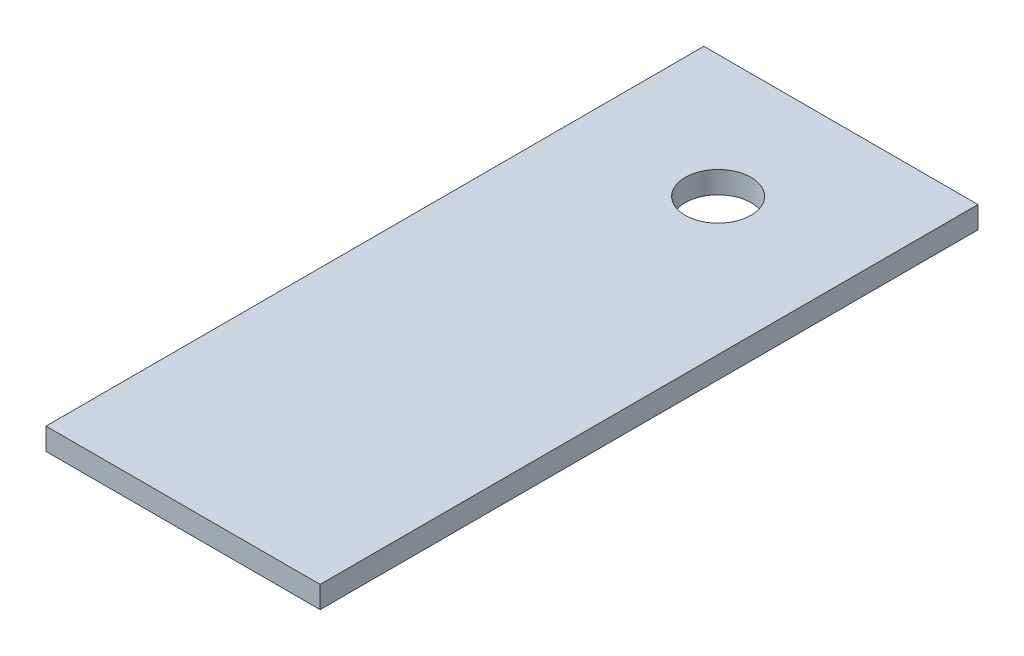
ISO-10303-21;
HEADER;
FILE_DESCRIPTION(('STEP AP214'),'2;1');
FILE_NAME('part.step','',(''),(''),'','','');
FILE_SCHEMA(('AUTOMOTIVE_DESIGN { 1 0 10303 214 1 1 1 1 }'));
ENDSEC;
DATA;
#1=APPLICATION_CONTEXT('core data for automotive mechanical design processes');
#2=APPLICATION_PROTOCOL_DEFINITION('international standard','automotive_design',2000,#1);
#3=PRODUCT_CONTEXT('',#1,'mechanical');
#4=PRODUCT('Part','Part','',(#3));
#5=PRODUCT_RELATED_PRODUCT_CATEGORY('part','',(#4));
#6=PRODUCT_DEFINITION_FORMATION('','',#4);
#7=PRODUCT_DEFINITION_CONTEXT('part definition',#1,'design');
#8=PRODUCT_DEFINITION('design','',#6,#7);
#9=PRODUCT_DEFINITION_SHAPE('','',#8);
#10=(LENGTH_UNIT() NAMED_UNIT(*) SI_UNIT(.MILLI.,.METRE.));
#11=(NAMED_UNIT(*) PLANE_ANGLE_UNIT() SI_UNIT($,.RADIAN.));
#12=(NAMED_UNIT(*) SI_UNIT($,.STERADIAN.) SOLID_ANGLE_UNIT());
#13=UNCERTAINTY_MEASURE_WITH_UNIT(LENGTH_MEASURE(1.E-05),#10,'distance_accuracy_value','');
#14=(GEOMETRIC_REPRESENTATION_CONTEXT(3) GLOBAL_UNCERTAINTY_ASSIGNED_CONTEXT((#13)) GLOBAL_UNIT_ASSIGNED_CONTEXT((#10,
#11,#12)) REPRESENTATION_CONTEXT('',''));
#15=CARTESIAN_POINT('',(0.,0.,0.));
#16=DIRECTION('',(0.,0.,1.));
#17=DIRECTION('',(1.,0.,0.));
#18=AXIS2_PLACEMENT_3D('',#15,#16,#17);
#19=CARTESIAN_POINT('',(0.,2.,0.));
#20=DIRECTION('',(0.,1.,0.));
#21=DIRECTION('',(0.,0.,1.));
#22=AXIS2_PLACEMENT_3D('',#19,#20,#21);
#23=PLANE('',#22);
#24=DIRECTION('',(0.,0.,-1.));
#25=VECTOR('',#24,1.);
#26=CARTESIAN_POINT('',(12.5,2.,-30.));
#27=LINE('',#26,#25);
#28=CARTESIAN_POINT('',(12.5,2.,30.));
#29=VERTEX_POINT('',#28);
#30=CARTESIAN_POINT('',(12.5,2.,-30.));
#31=VERTEX_POINT('',#30);
#32=EDGE_CURVE('E92',#29,#31,#27,.T.);
#33=ORIENTED_EDGE('',*,*,#32,.T.);
#34=DIRECTION('',(-1.,0.,0.));
#35=VECTOR('',#34,1.);
#36=CARTESIAN_POINT('',(-12.5,2.,-30.));
#37=LINE('',#36,#35);
#38=CARTESIAN_POINT('',(-12.5,2.,-30.));
#39=VERTEX_POINT('',#38);
#40=EDGE_CURVE('E87',#31,#39,#37,.T.);
#41=ORIENTED_EDGE('',*,*,#40,.T.);
#42=DIRECTION('',(0.,0.,1.));
#43=VECTOR('',#42,1.);
#44=CARTESIAN_POINT('',(-12.5,2.,-30.));
#45=LINE('',#44,#43);
#46=CARTESIAN_POINT('',(-12.5,2.,30.));
#47=VERTEX_POINT('',#46);
#48=EDGE_CURVE('E90',#39,#47,#45,.T.);
#49=ORIENTED_EDGE('',*,*,#48,.T.);
#50=DIRECTION('',(1.,0.,0.));
#51=VECTOR('',#50,1.);
#52=CARTESIAN_POINT('',(-12.5,2.,30.));
#53=LINE('',#52,#51);
#54=EDGE_CURVE('E57',#47,#29,#53,.T.);
#55=ORIENTED_EDGE('',*,*,#54,.T.);
#56=EDGE_LOOP('',(#33,#41,#49,#55));
#57=FACE_BOUND('',#56,.T.);
#58=CARTESIAN_POINT('',(0.,2.,-18.8));
#59=DIRECTION('',(0.,1.,0.));
#60=DIRECTION('',(0.,0.,1.));
#61=AXIS2_PLACEMENT_3D('',#58,#59,#60);
#62=CIRCLE('',#61,3.);
#63=CARTESIAN_POINT('',(0.,2.,-15.8));
#64=VERTEX_POINT('',#63);
#65=EDGE_CURVE('E112',#64,#64,#62,.T.);
#66=ORIENTED_EDGE('',*,*,#65,.F.);
#67=EDGE_LOOP('',(#66));
#68=FACE_BOUND('',#67,.T.);
#69=ADVANCED_FACE('F39',(#57,#68),#23,.T.);
#70=CARTESIAN_POINT('',(0.,0.,0.));
#71=DIRECTION('',(0.,1.,0.));
#72=DIRECTION('',(0.,0.,1.));
#73=AXIS2_PLACEMENT_3D('',#70,#71,#72);
#74=PLANE('',#73);
#75=DIRECTION('',(0.,0.,-1.));
#76=VECTOR('',#75,1.);
#77=CARTESIAN_POINT('',(12.5,0.,-30.));
#78=LINE('',#77,#76);
#79=CARTESIAN_POINT('',(12.5,0.,30.));
#80=VERTEX_POINT('',#79);
#81=CARTESIAN_POINT('',(12.5,0.,-30.));
#82=VERTEX_POINT('',#81);
#83=EDGE_CURVE('E108',#80,#82,#78,.T.);
#84=ORIENTED_EDGE('',*,*,#83,.F.);
#85=DIRECTION('',(1.,0.,0.));
#86=VECTOR('',#85,1.);
#87=CARTESIAN_POINT('',(-12.5,0.,30.));
#88=LINE('',#87,#86);
#89=CARTESIAN_POINT('',(-12.5,0.,30.));
#90=VERTEX_POINT('',#89);
#91=EDGE_CURVE('E80',#90,#80,#88,.T.);
#92=ORIENTED_EDGE('',*,*,#91,.F.);
#93=DIRECTION('',(0.,0.,1.));
#94=VECTOR('',#93,1.);
#95=CARTESIAN_POINT('',(-12.5,0.,-30.));
#96=LINE('',#95,#94);
#97=CARTESIAN_POINT('',(-12.5,0.,-30.));
#98=VERTEX_POINT('',#97);
#99=EDGE_CURVE('E74',#98,#90,#96,.T.);
#100=ORIENTED_EDGE('',*,*,#99,.F.);
#101=DIRECTION('',(-1.,0.,0.));
#102=VECTOR('',#101,1.);
#103=CARTESIAN_POINT('',(-12.5,0.,-30.));
#104=LINE('',#103,#102);
#105=EDGE_CURVE('E97',#82,#98,#104,.T.);
#106=ORIENTED_EDGE('',*,*,#105,.F.);
#107=EDGE_LOOP('',(#84,#92,#100,#106));
#108=FACE_BOUND('',#107,.T.);
#109=CARTESIAN_POINT('',(0.,0.,-18.8));
#110=DIRECTION('',(0.,1.,0.));
#111=DIRECTION('',(0.,0.,1.));
#112=AXIS2_PLACEMENT_3D('',#109,#110,#111);
#113=CIRCLE('',#112,3.);
#114=CARTESIAN_POINT('',(0.,0.,-15.8));
#115=VERTEX_POINT('',#114);
#116=EDGE_CURVE('E130',#115,#115,#113,.T.);
#117=ORIENTED_EDGE('',*,*,#116,.T.);
#118=EDGE_LOOP('',(#117));
#119=FACE_BOUND('',#118,.T.);
#120=ADVANCED_FACE('F125',(#108,#119),#74,.F.);
#121=CARTESIAN_POINT('',(12.5,2.,-30.));
#122=DIRECTION('',(-1.,0.,0.));
#123=DIRECTION('',(0.,0.,1.));
#124=AXIS2_PLACEMENT_3D('',#121,#122,#123);
#125=PLANE('',#124);
#126=ORIENTED_EDGE('',*,*,#83,.T.);
#127=DIRECTION('',(0.,-1.,0.));
#128=VECTOR('',#127,1.);
#129=CARTESIAN_POINT('',(12.5,2.,-30.));
#130=LINE('',#129,#128);
#131=EDGE_CURVE('E11',#31,#82,#130,.T.);
#132=ORIENTED_EDGE('',*,*,#131,.F.);
#133=ORIENTED_EDGE('',*,*,#32,.F.);
#134=DIRECTION('',(0.,-1.,0.));
#135=VECTOR('',#134,1.);
#136=CARTESIAN_POINT('',(12.5,2.,30.));
#137=LINE('',#136,#135);
#138=EDGE_CURVE('E104',#29,#80,#137,.T.);
#139=ORIENTED_EDGE('',*,*,#138,.T.);
#140=EDGE_LOOP('',(#126,#132,#133,#139));
#141=FACE_BOUND('',#140,.T.);
#142=ADVANCED_FACE('F41',(#141),#125,.F.);
#143=CARTESIAN_POINT('',(-12.5,2.,-30.));
#144=DIRECTION('',(0.,0.,1.));
#145=DIRECTION('',(1.,0.,0.));
#146=AXIS2_PLACEMENT_3D('',#143,#144,#145);
#147=PLANE('',#146);
#148=ORIENTED_EDGE('',*,*,#105,.T.);
#149=DIRECTION('',(0.,-1.,0.));
#150=VECTOR('',#149,1.);
#151=CARTESIAN_POINT('',(-12.5,2.,-30.));
#152=LINE('',#151,#150);
#153=EDGE_CURVE('E49',#39,#98,#152,.T.);
#154=ORIENTED_EDGE('',*,*,#153,.F.);
#155=ORIENTED_EDGE('',*,*,#40,.F.);
#156=ORIENTED_EDGE('',*,*,#131,.T.);
#157=EDGE_LOOP('',(#148,#154,#155,#156));
#158=FACE_BOUND('',#157,.T.);
#159=ADVANCED_FACE('F96',(#158),#147,.F.);
#160=CARTESIAN_POINT('',(-12.5,2.,-30.));
#161=DIRECTION('',(1.,0.,0.));
#162=DIRECTION('',(0.,0.,-1.));
#163=AXIS2_PLACEMENT_3D('',#160,#161,#162);
#164=PLANE('',#163);
#165=ORIENTED_EDGE('',*,*,#99,.T.);
#166=DIRECTION('',(0.,-1.,0.));
#167=VECTOR('',#166,1.);
#168=CARTESIAN_POINT('',(-12.5,2.,30.));
#169=LINE('',#168,#167);
#170=EDGE_CURVE('E99',#47,#90,#169,.T.);
#171=ORIENTED_EDGE('',*,*,#170,.F.);
#172=ORIENTED_EDGE('',*,*,#48,.F.);
#173=ORIENTED_EDGE('',*,*,#153,.T.);
#174=EDGE_LOOP('',(#165,#171,#172,#173));
#175=FACE_BOUND('',#174,.T.);
#176=ADVANCED_FACE('F100',(#175),#164,.F.);
#177=CARTESIAN_POINT('',(-12.5,2.,30.));
#178=DIRECTION('',(0.,0.,-1.));
#179=DIRECTION('',(-1.,0.,0.));
#180=AXIS2_PLACEMENT_3D('',#177,#178,#179);
#181=PLANE('',#180);
#182=ORIENTED_EDGE('',*,*,#91,.T.);
#183=ORIENTED_EDGE('',*,*,#138,.F.);
#184=ORIENTED_EDGE('',*,*,#54,.F.);
#185=ORIENTED_EDGE('',*,*,#170,.T.);
#186=EDGE_LOOP('',(#182,#183,#184,#185));
#187=FACE_BOUND('',#186,.T.);
#188=ADVANCED_FACE('F122',(#187),#181,.F.);
#189=CARTESIAN_POINT('',(0.,2.,-18.8));
#190=DIRECTION('',(0.,-1.,0.));
#191=DIRECTION('',(0.,0.,-1.));
#192=AXIS2_PLACEMENT_3D('',#189,#190,#191);
#193=CYLINDRICAL_SURFACE('',#192,3.);
#194=ORIENTED_EDGE('',*,*,#65,.T.);
#195=EDGE_LOOP('',(#194));
#196=FACE_BOUND('',#195,.T.);
#197=ORIENTED_EDGE('',*,*,#116,.F.);
#198=EDGE_LOOP('',(#197));
#199=FACE_BOUND('',#198,.T.);
#200=ADVANCED_FACE('F138',(#196,#199),#193,.F.);
#201=CLOSED_SHELL('',(#69,#120,#142,#159,#176,#188,#200));
#202=MANIFOLD_SOLID_BREP('B2',#201);
#203=ADVANCED_BREP_SHAPE_REPRESENTATION('',(#18,#202),#14);
#204=SHAPE_DEFINITION_REPRESENTATION(#9,#203);
ENDSEC;
END-ISO-10303-21;
